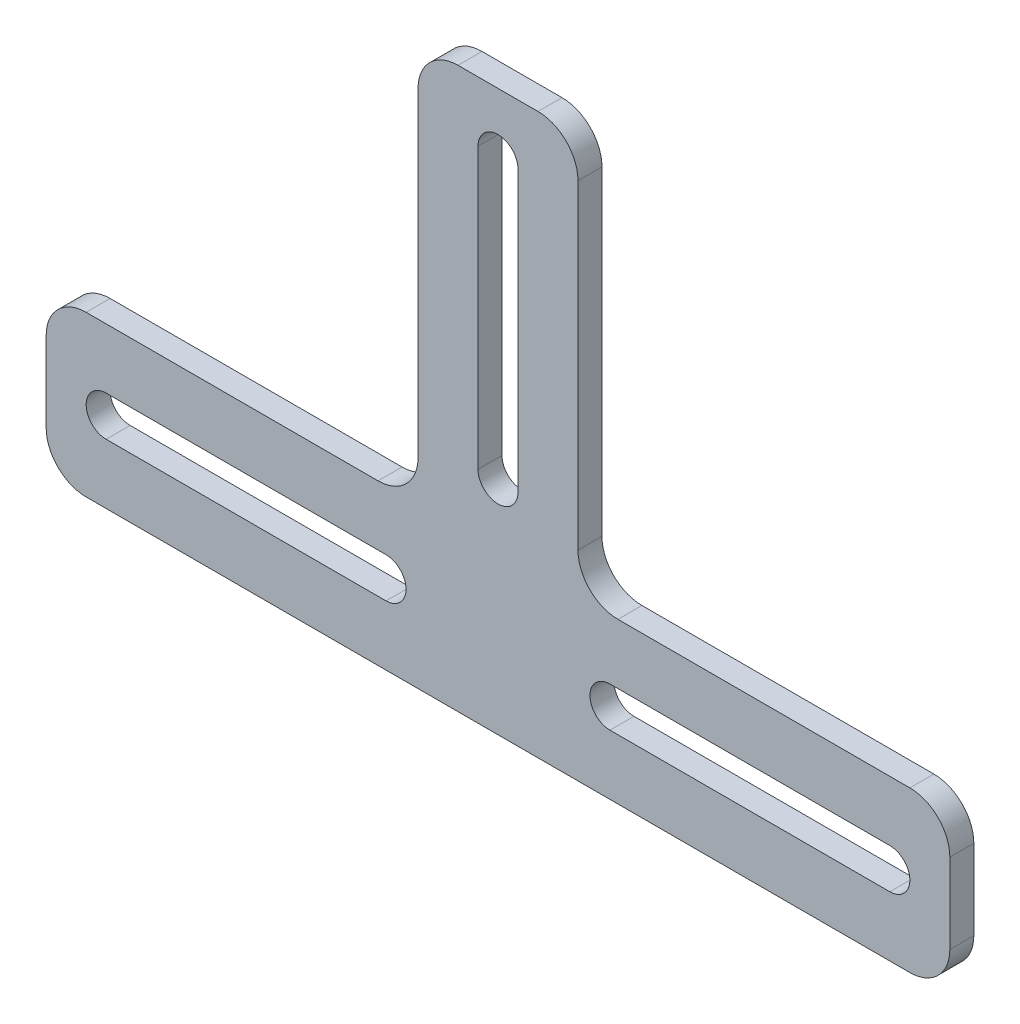
ISO-10303-21;
HEADER;
FILE_DESCRIPTION(('STEP AP214'),'2;1');
FILE_NAME('part.step','',(''),(''),'','','');
FILE_SCHEMA(('AUTOMOTIVE_DESIGN { 1 0 10303 214 1 1 1 1 }'));
ENDSEC;
DATA;
#1=APPLICATION_CONTEXT('core data for automotive mechanical design processes');
#2=APPLICATION_PROTOCOL_DEFINITION('international standard','automotive_design',2000,#1);
#3=PRODUCT_CONTEXT('',#1,'mechanical');
#4=PRODUCT('Part','Part','',(#3));
#5=PRODUCT_RELATED_PRODUCT_CATEGORY('part','',(#4));
#6=PRODUCT_DEFINITION_FORMATION('','',#4);
#7=PRODUCT_DEFINITION_CONTEXT('part definition',#1,'design');
#8=PRODUCT_DEFINITION('design','',#6,#7);
#9=PRODUCT_DEFINITION_SHAPE('','',#8);
#10=(LENGTH_UNIT() NAMED_UNIT(*) SI_UNIT(.MILLI.,.METRE.));
#11=(NAMED_UNIT(*) PLANE_ANGLE_UNIT() SI_UNIT($,.RADIAN.));
#12=(NAMED_UNIT(*) SI_UNIT($,.STERADIAN.) SOLID_ANGLE_UNIT());
#13=UNCERTAINTY_MEASURE_WITH_UNIT(LENGTH_MEASURE(1.E-05),#10,'distance_accuracy_value','');
#14=(GEOMETRIC_REPRESENTATION_CONTEXT(3) GLOBAL_UNCERTAINTY_ASSIGNED_CONTEXT((#13)) GLOBAL_UNIT_ASSIGNED_CONTEXT((#10,
#11,#12)) REPRESENTATION_CONTEXT('',''));
#15=CARTESIAN_POINT('',(0.,0.,0.));
#16=DIRECTION('',(0.,0.,1.));
#17=DIRECTION('',(1.,0.,0.));
#18=AXIS2_PLACEMENT_3D('',#15,#16,#17);
#19=CARTESIAN_POINT('',(0.,0.,3.));
#20=DIRECTION('',(0.,0.,-1.));
#21=DIRECTION('',(-1.,0.,0.));
#22=AXIS2_PLACEMENT_3D('',#19,#20,#21);
#23=PLANE('',#22);
#24=CARTESIAN_POINT('',(49.,9.99999999999996,3.));
#25=DIRECTION('',(0.,0.,1.));
#26=DIRECTION('',(1.,0.,0.));
#27=AXIS2_PLACEMENT_3D('',#24,#25,#26);
#28=CIRCLE('',#27,2.5);
#29=CARTESIAN_POINT('',(49.,7.49999999999997,3.));
#30=VERTEX_POINT('',#29);
#31=CARTESIAN_POINT('',(49.,12.5,3.));
#32=VERTEX_POINT('',#31);
#33=EDGE_CURVE('E261',#30,#32,#28,.T.);
#34=ORIENTED_EDGE('',*,*,#33,.F.);
#35=DIRECTION('',(1.,0.,0.));
#36=VECTOR('',#35,1.);
#37=CARTESIAN_POINT('',(49.,7.49999999999997,3.));
#38=LINE('',#37,#36);
#39=CARTESIAN_POINT('',(14.,7.49999999999997,3.));
#40=VERTEX_POINT('',#39);
#41=EDGE_CURVE('E269',#40,#30,#38,.T.);
#42=ORIENTED_EDGE('',*,*,#41,.F.);
#43=CARTESIAN_POINT('',(14.,9.99999999999997,3.));
#44=DIRECTION('',(0.,0.,1.));
#45=DIRECTION('',(1.,0.,0.));
#46=AXIS2_PLACEMENT_3D('',#43,#44,#45);
#47=CIRCLE('',#46,2.5);
#48=CARTESIAN_POINT('',(14.,12.5,3.));
#49=VERTEX_POINT('',#48);
#50=EDGE_CURVE('E266',#49,#40,#47,.T.);
#51=ORIENTED_EDGE('',*,*,#50,.F.);
#52=DIRECTION('',(-1.,0.,0.));
#53=VECTOR('',#52,1.);
#54=CARTESIAN_POINT('',(49.,12.5,3.));
#55=LINE('',#54,#53);
#56=EDGE_CURVE('E263',#32,#49,#55,.T.);
#57=ORIENTED_EDGE('',*,*,#56,.F.);
#58=EDGE_LOOP('',(#34,#42,#51,#57));
#59=FACE_BOUND('',#58,.T.);
#60=DIRECTION('',(0.,-1.,0.));
#61=VECTOR('',#60,1.);
#62=CARTESIAN_POINT('',(-56.5,0.,3.));
#63=LINE('',#62,#61);
#64=CARTESIAN_POINT('',(-56.5,15.,3.));
#65=VERTEX_POINT('',#64);
#66=CARTESIAN_POINT('',(-56.5,5.00000000000004,3.));
#67=VERTEX_POINT('',#66);
#68=EDGE_CURVE('E330',#65,#67,#63,.T.);
#69=ORIENTED_EDGE('',*,*,#68,.T.);
#70=CARTESIAN_POINT('',(-51.5,5.00000000000003,3.));
#71=DIRECTION('',(0.,0.,-1.));
#72=DIRECTION('',(-1.,0.,0.));
#73=AXIS2_PLACEMENT_3D('',#70,#71,#72);
#74=CIRCLE('',#73,5.);
#75=CARTESIAN_POINT('',(-51.5,0.,3.));
#76=VERTEX_POINT('',#75);
#77=EDGE_CURVE('E408',#67,#76,#74,.F.);
#78=ORIENTED_EDGE('',*,*,#77,.T.);
#79=DIRECTION('',(1.,0.,0.));
#80=VECTOR('',#79,1.);
#81=CARTESIAN_POINT('',(0.,0.,3.));
#82=LINE('',#81,#80);
#83=CARTESIAN_POINT('',(51.5,0.,3.));
#84=VERTEX_POINT('',#83);
#85=EDGE_CURVE('E333',#76,#84,#82,.T.);
#86=ORIENTED_EDGE('',*,*,#85,.T.);
#87=CARTESIAN_POINT('',(51.5,4.99999999999997,3.));
#88=DIRECTION('',(0.,0.,-1.));
#89=DIRECTION('',(-1.,0.,0.));
#90=AXIS2_PLACEMENT_3D('',#87,#88,#89);
#91=CIRCLE('',#90,5.);
#92=CARTESIAN_POINT('',(56.5,4.99999999999997,3.));
#93=VERTEX_POINT('',#92);
#94=EDGE_CURVE('E401',#84,#93,#91,.F.);
#95=ORIENTED_EDGE('',*,*,#94,.T.);
#96=DIRECTION('',(0.,1.,0.));
#97=VECTOR('',#96,1.);
#98=CARTESIAN_POINT('',(56.5,0.,3.));
#99=LINE('',#98,#97);
#100=CARTESIAN_POINT('',(56.5,15.,3.));
#101=VERTEX_POINT('',#100);
#102=EDGE_CURVE('E336',#93,#101,#99,.T.);
#103=ORIENTED_EDGE('',*,*,#102,.T.);
#104=CARTESIAN_POINT('',(51.5,15.,3.));
#105=DIRECTION('',(0.,0.,-1.));
#106=DIRECTION('',(-1.,0.,0.));
#107=AXIS2_PLACEMENT_3D('',#104,#105,#106);
#108=CIRCLE('',#107,5.);
#109=CARTESIAN_POINT('',(51.5,20.,3.));
#110=VERTEX_POINT('',#109);
#111=EDGE_CURVE('E399',#101,#110,#108,.F.);
#112=ORIENTED_EDGE('',*,*,#111,.T.);
#113=DIRECTION('',(-1.,0.,0.));
#114=VECTOR('',#113,1.);
#115=CARTESIAN_POINT('',(56.5,20.,3.));
#116=LINE('',#115,#114);
#117=CARTESIAN_POINT('',(15.,20.,3.));
#118=VERTEX_POINT('',#117);
#119=EDGE_CURVE('E339',#110,#118,#116,.T.);
#120=ORIENTED_EDGE('',*,*,#119,.T.);
#121=CARTESIAN_POINT('',(15.,25.,3.));
#122=DIRECTION('',(0.,0.,-1.));
#123=DIRECTION('',(-1.,0.,0.));
#124=AXIS2_PLACEMENT_3D('',#121,#122,#123);
#125=CIRCLE('',#124,5.);
#126=CARTESIAN_POINT('',(10.,25.,3.));
#127=VERTEX_POINT('',#126);
#128=EDGE_CURVE('E11',#118,#127,#125,.T.);
#129=ORIENTED_EDGE('',*,*,#128,.T.);
#130=DIRECTION('',(0.,1.,0.));
#131=VECTOR('',#130,1.);
#132=CARTESIAN_POINT('',(10.,20.,3.));
#133=LINE('',#132,#131);
#134=CARTESIAN_POINT('',(10.,65.,3.));
#135=VERTEX_POINT('',#134);
#136=EDGE_CURVE('E342',#127,#135,#133,.T.);
#137=ORIENTED_EDGE('',*,*,#136,.T.);
#138=CARTESIAN_POINT('',(5.,65.,3.));
#139=DIRECTION('',(0.,0.,-1.));
#140=DIRECTION('',(-1.,0.,0.));
#141=AXIS2_PLACEMENT_3D('',#138,#139,#140);
#142=CIRCLE('',#141,5.);
#143=CARTESIAN_POINT('',(5.,70.,3.));
#144=VERTEX_POINT('',#143);
#145=EDGE_CURVE('E55',#135,#144,#142,.F.);
#146=ORIENTED_EDGE('',*,*,#145,.T.);
#147=DIRECTION('',(-1.,0.,0.));
#148=VECTOR('',#147,1.);
#149=CARTESIAN_POINT('',(-10.,70.,3.));
#150=LINE('',#149,#148);
#151=CARTESIAN_POINT('',(-5.,70.,3.));
#152=VERTEX_POINT('',#151);
#153=EDGE_CURVE('E344',#144,#152,#150,.T.);
#154=ORIENTED_EDGE('',*,*,#153,.T.);
#155=CARTESIAN_POINT('',(-5.,65.,3.));
#156=DIRECTION('',(0.,0.,-1.));
#157=DIRECTION('',(-1.,0.,0.));
#158=AXIS2_PLACEMENT_3D('',#155,#156,#157);
#159=CIRCLE('',#158,5.);
#160=CARTESIAN_POINT('',(-10.,65.,3.));
#161=VERTEX_POINT('',#160);
#162=EDGE_CURVE('E406',#152,#161,#159,.F.);
#163=ORIENTED_EDGE('',*,*,#162,.T.);
#164=DIRECTION('',(0.,-1.,0.));
#165=VECTOR('',#164,1.);
#166=CARTESIAN_POINT('',(-10.,20.,3.));
#167=LINE('',#166,#165);
#168=CARTESIAN_POINT('',(-10.,25.,3.));
#169=VERTEX_POINT('',#168);
#170=EDGE_CURVE('E323',#161,#169,#167,.T.);
#171=ORIENTED_EDGE('',*,*,#170,.T.);
#172=CARTESIAN_POINT('',(-15.,25.,3.));
#173=DIRECTION('',(0.,0.,-1.));
#174=DIRECTION('',(-1.,0.,0.));
#175=AXIS2_PLACEMENT_3D('',#172,#173,#174);
#176=CIRCLE('',#175,5.);
#177=CARTESIAN_POINT('',(-15.,20.,3.));
#178=VERTEX_POINT('',#177);
#179=EDGE_CURVE('E431',#169,#178,#176,.T.);
#180=ORIENTED_EDGE('',*,*,#179,.T.);
#181=DIRECTION('',(-1.,0.,0.));
#182=VECTOR('',#181,1.);
#183=CARTESIAN_POINT('',(-56.5,20.,3.));
#184=LINE('',#183,#182);
#185=CARTESIAN_POINT('',(-51.5,20.,3.));
#186=VERTEX_POINT('',#185);
#187=EDGE_CURVE('E326',#178,#186,#184,.T.);
#188=ORIENTED_EDGE('',*,*,#187,.T.);
#189=CARTESIAN_POINT('',(-51.5,15.,3.));
#190=DIRECTION('',(0.,0.,-1.));
#191=DIRECTION('',(-1.,0.,0.));
#192=AXIS2_PLACEMENT_3D('',#189,#190,#191);
#193=CIRCLE('',#192,5.);
#194=EDGE_CURVE('E403',#186,#65,#193,.F.);
#195=ORIENTED_EDGE('',*,*,#194,.T.);
#196=EDGE_LOOP('',(#69,#78,#86,#95,#103,#112,#120,#129,#137,#146,#154,#163,#171,#180,#188,#195));
#197=FACE_BOUND('',#196,.T.);
#198=CARTESIAN_POINT('',(0.,62.5,3.));
#199=DIRECTION('',(0.,0.,1.));
#200=DIRECTION('',(1.,0.,0.));
#201=AXIS2_PLACEMENT_3D('',#198,#199,#200);
#202=CIRCLE('',#201,2.5);
#203=CARTESIAN_POINT('',(2.5,62.5,3.));
#204=VERTEX_POINT('',#203);
#205=CARTESIAN_POINT('',(-2.5,62.5,3.));
#206=VERTEX_POINT('',#205);
#207=EDGE_CURVE('E292',#204,#206,#202,.T.);
#208=ORIENTED_EDGE('',*,*,#207,.F.);
#209=DIRECTION('',(0.,1.,0.));
#210=VECTOR('',#209,1.);
#211=CARTESIAN_POINT('',(2.5,62.5,3.));
#212=LINE('',#211,#210);
#213=CARTESIAN_POINT('',(2.50000000000001,27.5,3.));
#214=VERTEX_POINT('',#213);
#215=EDGE_CURVE('E300',#214,#204,#212,.T.);
#216=ORIENTED_EDGE('',*,*,#215,.F.);
#217=CARTESIAN_POINT('',(0.,27.5,3.));
#218=DIRECTION('',(0.,0.,1.));
#219=DIRECTION('',(1.,0.,0.));
#220=AXIS2_PLACEMENT_3D('',#217,#218,#219);
#221=CIRCLE('',#220,2.5);
#222=CARTESIAN_POINT('',(-2.5,27.5,3.));
#223=VERTEX_POINT('',#222);
#224=EDGE_CURVE('E297',#223,#214,#221,.T.);
#225=ORIENTED_EDGE('',*,*,#224,.F.);
#226=DIRECTION('',(0.,-1.,0.));
#227=VECTOR('',#226,1.);
#228=CARTESIAN_POINT('',(-2.5,62.5,3.));
#229=LINE('',#228,#227);
#230=EDGE_CURVE('E294',#206,#223,#229,.T.);
#231=ORIENTED_EDGE('',*,*,#230,.F.);
#232=EDGE_LOOP('',(#208,#216,#225,#231));
#233=FACE_BOUND('',#232,.T.);
#234=CARTESIAN_POINT('',(-49.,9.99999999999996,3.));
#235=DIRECTION('',(0.,0.,1.));
#236=DIRECTION('',(-1.,0.,0.));
#237=AXIS2_PLACEMENT_3D('',#234,#235,#236);
#238=CIRCLE('',#237,2.5);
#239=CARTESIAN_POINT('',(-49.,12.5,3.));
#240=VERTEX_POINT('',#239);
#241=CARTESIAN_POINT('',(-49.,7.49999999999997,3.));
#242=VERTEX_POINT('',#241);
#243=EDGE_CURVE('E220',#240,#242,#238,.T.);
#244=ORIENTED_EDGE('',*,*,#243,.F.);
#245=DIRECTION('',(-1.,0.,0.));
#246=VECTOR('',#245,1.);
#247=CARTESIAN_POINT('',(-49.,12.5,3.));
#248=LINE('',#247,#246);
#249=CARTESIAN_POINT('',(-14.,12.5,3.));
#250=VERTEX_POINT('',#249);
#251=EDGE_CURVE('E245',#250,#240,#248,.T.);
#252=ORIENTED_EDGE('',*,*,#251,.F.);
#253=CARTESIAN_POINT('',(-14.,9.99999999999997,3.));
#254=DIRECTION('',(0.,0.,1.));
#255=DIRECTION('',(-1.,0.,0.));
#256=AXIS2_PLACEMENT_3D('',#253,#254,#255);
#257=CIRCLE('',#256,2.5);
#258=CARTESIAN_POINT('',(-14.,7.49999999999997,3.));
#259=VERTEX_POINT('',#258);
#260=EDGE_CURVE('E243',#259,#250,#257,.T.);
#261=ORIENTED_EDGE('',*,*,#260,.F.);
#262=DIRECTION('',(1.,0.,0.));
#263=VECTOR('',#262,1.);
#264=CARTESIAN_POINT('',(-49.,7.49999999999997,3.));
#265=LINE('',#264,#263);
#266=EDGE_CURVE('E230',#242,#259,#265,.T.);
#267=ORIENTED_EDGE('',*,*,#266,.F.);
#268=EDGE_LOOP('',(#244,#252,#261,#267));
#269=FACE_BOUND('',#268,.T.);
#270=ADVANCED_FACE('F33',(#59,#197,#233,#269),#23,.F.);
#271=CARTESIAN_POINT('',(0.,0.,0.));
#272=DIRECTION('',(0.,0.,-1.));
#273=DIRECTION('',(-1.,0.,0.));
#274=AXIS2_PLACEMENT_3D('',#271,#272,#273);
#275=PLANE('',#274);
#276=DIRECTION('',(1.,0.,0.));
#277=VECTOR('',#276,1.);
#278=CARTESIAN_POINT('',(0.,0.,0.));
#279=LINE('',#278,#277);
#280=CARTESIAN_POINT('',(-51.5,0.,0.));
#281=VERTEX_POINT('',#280);
#282=CARTESIAN_POINT('',(51.5,0.,0.));
#283=VERTEX_POINT('',#282);
#284=EDGE_CURVE('E355',#281,#283,#279,.T.);
#285=ORIENTED_EDGE('',*,*,#284,.F.);
#286=CARTESIAN_POINT('',(-51.5,5.00000000000003,0.));
#287=DIRECTION('',(0.,0.,-1.));
#288=DIRECTION('',(-1.,0.,0.));
#289=AXIS2_PLACEMENT_3D('',#286,#287,#288);
#290=CIRCLE('',#289,5.);
#291=CARTESIAN_POINT('',(-56.5,5.00000000000004,0.));
#292=VERTEX_POINT('',#291);
#293=EDGE_CURVE('E392',#281,#292,#290,.T.);
#294=ORIENTED_EDGE('',*,*,#293,.T.);
#295=DIRECTION('',(0.,-1.,0.));
#296=VECTOR('',#295,1.);
#297=CARTESIAN_POINT('',(-56.5,0.,0.));
#298=LINE('',#297,#296);
#299=CARTESIAN_POINT('',(-56.5,15.,0.));
#300=VERTEX_POINT('',#299);
#301=EDGE_CURVE('E352',#300,#292,#298,.T.);
#302=ORIENTED_EDGE('',*,*,#301,.F.);
#303=CARTESIAN_POINT('',(-51.5,15.,0.));
#304=DIRECTION('',(0.,0.,-1.));
#305=DIRECTION('',(-1.,0.,0.));
#306=AXIS2_PLACEMENT_3D('',#303,#304,#305);
#307=CIRCLE('',#306,5.);
#308=CARTESIAN_POINT('',(-51.5,20.,0.));
#309=VERTEX_POINT('',#308);
#310=EDGE_CURVE('E386',#300,#309,#307,.T.);
#311=ORIENTED_EDGE('',*,*,#310,.T.);
#312=DIRECTION('',(-1.,0.,0.));
#313=VECTOR('',#312,1.);
#314=CARTESIAN_POINT('',(-56.5,20.,0.));
#315=LINE('',#314,#313);
#316=CARTESIAN_POINT('',(-15.,20.,0.));
#317=VERTEX_POINT('',#316);
#318=EDGE_CURVE('E349',#317,#309,#315,.T.);
#319=ORIENTED_EDGE('',*,*,#318,.F.);
#320=CARTESIAN_POINT('',(-15.,25.,0.));
#321=DIRECTION('',(0.,0.,-1.));
#322=DIRECTION('',(-1.,0.,0.));
#323=AXIS2_PLACEMENT_3D('',#320,#321,#322);
#324=CIRCLE('',#323,5.);
#325=CARTESIAN_POINT('',(-10.,25.,0.));
#326=VERTEX_POINT('',#325);
#327=EDGE_CURVE('E429',#317,#326,#324,.F.);
#328=ORIENTED_EDGE('',*,*,#327,.T.);
#329=DIRECTION('',(0.,-1.,0.));
#330=VECTOR('',#329,1.);
#331=CARTESIAN_POINT('',(-10.,20.,0.));
#332=LINE('',#331,#330);
#333=CARTESIAN_POINT('',(-10.,65.,0.));
#334=VERTEX_POINT('',#333);
#335=EDGE_CURVE('E322',#334,#326,#332,.T.);
#336=ORIENTED_EDGE('',*,*,#335,.F.);
#337=CARTESIAN_POINT('',(-5.,65.,0.));
#338=DIRECTION('',(0.,0.,-1.));
#339=DIRECTION('',(-1.,0.,0.));
#340=AXIS2_PLACEMENT_3D('',#337,#338,#339);
#341=CIRCLE('',#340,5.);
#342=CARTESIAN_POINT('',(-5.,70.,0.));
#343=VERTEX_POINT('',#342);
#344=EDGE_CURVE('E390',#334,#343,#341,.T.);
#345=ORIENTED_EDGE('',*,*,#344,.T.);
#346=DIRECTION('',(-1.,0.,0.));
#347=VECTOR('',#346,1.);
#348=CARTESIAN_POINT('',(-10.,70.,0.));
#349=LINE('',#348,#347);
#350=CARTESIAN_POINT('',(5.,70.,0.));
#351=VERTEX_POINT('',#350);
#352=EDGE_CURVE('E327',#351,#343,#349,.T.);
#353=ORIENTED_EDGE('',*,*,#352,.F.);
#354=CARTESIAN_POINT('',(5.,65.,0.));
#355=DIRECTION('',(0.,0.,-1.));
#356=DIRECTION('',(-1.,0.,0.));
#357=AXIS2_PLACEMENT_3D('',#354,#355,#356);
#358=CIRCLE('',#357,5.);
#359=CARTESIAN_POINT('',(10.,65.,0.));
#360=VERTEX_POINT('',#359);
#361=EDGE_CURVE('E388',#351,#360,#358,.T.);
#362=ORIENTED_EDGE('',*,*,#361,.T.);
#363=DIRECTION('',(0.,1.,0.));
#364=VECTOR('',#363,1.);
#365=CARTESIAN_POINT('',(10.,20.,0.));
#366=LINE('',#365,#364);
#367=CARTESIAN_POINT('',(10.,25.,0.));
#368=VERTEX_POINT('',#367);
#369=EDGE_CURVE('E364',#368,#360,#366,.T.);
#370=ORIENTED_EDGE('',*,*,#369,.F.);
#371=CARTESIAN_POINT('',(15.,25.,0.));
#372=DIRECTION('',(0.,0.,-1.));
#373=DIRECTION('',(-1.,0.,0.));
#374=AXIS2_PLACEMENT_3D('',#371,#372,#373);
#375=CIRCLE('',#374,5.);
#376=CARTESIAN_POINT('',(15.,20.,0.));
#377=VERTEX_POINT('',#376);
#378=EDGE_CURVE('E41',#368,#377,#375,.F.);
#379=ORIENTED_EDGE('',*,*,#378,.T.);
#380=DIRECTION('',(-1.,0.,0.));
#381=VECTOR('',#380,1.);
#382=CARTESIAN_POINT('',(56.5,20.,0.));
#383=LINE('',#382,#381);
#384=CARTESIAN_POINT('',(51.5,20.,0.));
#385=VERTEX_POINT('',#384);
#386=EDGE_CURVE('E361',#385,#377,#383,.T.);
#387=ORIENTED_EDGE('',*,*,#386,.F.);
#388=CARTESIAN_POINT('',(51.5,15.,0.));
#389=DIRECTION('',(0.,0.,-1.));
#390=DIRECTION('',(-1.,0.,0.));
#391=AXIS2_PLACEMENT_3D('',#388,#389,#390);
#392=CIRCLE('',#391,5.);
#393=CARTESIAN_POINT('',(56.5,15.,0.));
#394=VERTEX_POINT('',#393);
#395=EDGE_CURVE('E382',#385,#394,#392,.T.);
#396=ORIENTED_EDGE('',*,*,#395,.T.);
#397=DIRECTION('',(0.,1.,0.));
#398=VECTOR('',#397,1.);
#399=CARTESIAN_POINT('',(56.5,0.,0.));
#400=LINE('',#399,#398);
#401=CARTESIAN_POINT('',(56.5,4.99999999999997,0.));
#402=VERTEX_POINT('',#401);
#403=EDGE_CURVE('E358',#402,#394,#400,.T.);
#404=ORIENTED_EDGE('',*,*,#403,.F.);
#405=CARTESIAN_POINT('',(51.5,4.99999999999997,0.));
#406=DIRECTION('',(0.,0.,-1.));
#407=DIRECTION('',(-1.,0.,0.));
#408=AXIS2_PLACEMENT_3D('',#405,#406,#407);
#409=CIRCLE('',#408,5.);
#410=EDGE_CURVE('E384',#402,#283,#409,.T.);
#411=ORIENTED_EDGE('',*,*,#410,.T.);
#412=EDGE_LOOP('',(#285,#294,#302,#311,#319,#328,#336,#345,#353,#362,#370,#379,#387,#396,#404,#411));
#413=FACE_BOUND('',#412,.T.);
#414=DIRECTION('',(0.,1.,0.));
#415=VECTOR('',#414,1.);
#416=CARTESIAN_POINT('',(2.5,62.5,0.));
#417=LINE('',#416,#415);
#418=CARTESIAN_POINT('',(2.50000000000001,27.5,0.));
#419=VERTEX_POINT('',#418);
#420=CARTESIAN_POINT('',(2.5,62.5,0.));
#421=VERTEX_POINT('',#420);
#422=EDGE_CURVE('E295',#419,#421,#417,.T.);
#423=ORIENTED_EDGE('',*,*,#422,.T.);
#424=CARTESIAN_POINT('',(0.,62.5,0.));
#425=DIRECTION('',(0.,0.,1.));
#426=DIRECTION('',(1.,0.,0.));
#427=AXIS2_PLACEMENT_3D('',#424,#425,#426);
#428=CIRCLE('',#427,2.5);
#429=CARTESIAN_POINT('',(-2.5,62.5,0.));
#430=VERTEX_POINT('',#429);
#431=EDGE_CURVE('E291',#421,#430,#428,.T.);
#432=ORIENTED_EDGE('',*,*,#431,.T.);
#433=DIRECTION('',(0.,-1.,0.));
#434=VECTOR('',#433,1.);
#435=CARTESIAN_POINT('',(-2.5,62.5,0.));
#436=LINE('',#435,#434);
#437=CARTESIAN_POINT('',(-2.5,27.5,0.));
#438=VERTEX_POINT('',#437);
#439=EDGE_CURVE('E305',#430,#438,#436,.T.);
#440=ORIENTED_EDGE('',*,*,#439,.T.);
#441=CARTESIAN_POINT('',(0.,27.5,0.));
#442=DIRECTION('',(0.,0.,1.));
#443=DIRECTION('',(1.,0.,0.));
#444=AXIS2_PLACEMENT_3D('',#441,#442,#443);
#445=CIRCLE('',#444,2.5);
#446=EDGE_CURVE('E308',#438,#419,#445,.T.);
#447=ORIENTED_EDGE('',*,*,#446,.T.);
#448=EDGE_LOOP('',(#423,#432,#440,#447));
#449=FACE_BOUND('',#448,.T.);
#450=DIRECTION('',(1.,0.,0.));
#451=VECTOR('',#450,1.);
#452=CARTESIAN_POINT('',(49.,7.49999999999997,0.));
#453=LINE('',#452,#451);
#454=CARTESIAN_POINT('',(14.,7.49999999999997,0.));
#455=VERTEX_POINT('',#454);
#456=CARTESIAN_POINT('',(49.,7.49999999999997,0.));
#457=VERTEX_POINT('',#456);
#458=EDGE_CURVE('E264',#455,#457,#453,.T.);
#459=ORIENTED_EDGE('',*,*,#458,.T.);
#460=CARTESIAN_POINT('',(49.,9.99999999999996,0.));
#461=DIRECTION('',(0.,0.,1.));
#462=DIRECTION('',(1.,0.,0.));
#463=AXIS2_PLACEMENT_3D('',#460,#461,#462);
#464=CIRCLE('',#463,2.5);
#465=CARTESIAN_POINT('',(49.,12.5,0.));
#466=VERTEX_POINT('',#465);
#467=EDGE_CURVE('E238',#457,#466,#464,.T.);
#468=ORIENTED_EDGE('',*,*,#467,.T.);
#469=DIRECTION('',(-1.,0.,0.));
#470=VECTOR('',#469,1.);
#471=CARTESIAN_POINT('',(49.,12.5,0.));
#472=LINE('',#471,#470);
#473=CARTESIAN_POINT('',(14.,12.5,0.));
#474=VERTEX_POINT('',#473);
#475=EDGE_CURVE('E274',#466,#474,#472,.T.);
#476=ORIENTED_EDGE('',*,*,#475,.T.);
#477=CARTESIAN_POINT('',(14.,9.99999999999997,0.));
#478=DIRECTION('',(0.,0.,1.));
#479=DIRECTION('',(1.,0.,0.));
#480=AXIS2_PLACEMENT_3D('',#477,#478,#479);
#481=CIRCLE('',#480,2.5);
#482=EDGE_CURVE('E277',#474,#455,#481,.T.);
#483=ORIENTED_EDGE('',*,*,#482,.T.);
#484=EDGE_LOOP('',(#459,#468,#476,#483));
#485=FACE_BOUND('',#484,.T.);
#486=DIRECTION('',(-1.,0.,0.));
#487=VECTOR('',#486,1.);
#488=CARTESIAN_POINT('',(-49.,12.5,0.));
#489=LINE('',#488,#487);
#490=CARTESIAN_POINT('',(-14.,12.5,0.));
#491=VERTEX_POINT('',#490);
#492=CARTESIAN_POINT('',(-49.,12.5,0.));
#493=VERTEX_POINT('',#492);
#494=EDGE_CURVE('E231',#491,#493,#489,.T.);
#495=ORIENTED_EDGE('',*,*,#494,.T.);
#496=CARTESIAN_POINT('',(-49.,9.99999999999996,0.));
#497=DIRECTION('',(0.,0.,1.));
#498=DIRECTION('',(-1.,0.,0.));
#499=AXIS2_PLACEMENT_3D('',#496,#497,#498);
#500=CIRCLE('',#499,2.5);
#501=CARTESIAN_POINT('',(-49.,7.49999999999997,0.));
#502=VERTEX_POINT('',#501);
#503=EDGE_CURVE('E249',#493,#502,#500,.T.);
#504=ORIENTED_EDGE('',*,*,#503,.T.);
#505=DIRECTION('',(1.,0.,0.));
#506=VECTOR('',#505,1.);
#507=CARTESIAN_POINT('',(-49.,7.49999999999997,0.));
#508=LINE('',#507,#506);
#509=CARTESIAN_POINT('',(-14.,7.49999999999997,0.));
#510=VERTEX_POINT('',#509);
#511=EDGE_CURVE('E237',#502,#510,#508,.T.);
#512=ORIENTED_EDGE('',*,*,#511,.T.);
#513=CARTESIAN_POINT('',(-14.,9.99999999999997,0.));
#514=DIRECTION('',(0.,0.,1.));
#515=DIRECTION('',(-1.,0.,0.));
#516=AXIS2_PLACEMENT_3D('',#513,#514,#515);
#517=CIRCLE('',#516,2.5);
#518=EDGE_CURVE('E252',#510,#491,#517,.T.);
#519=ORIENTED_EDGE('',*,*,#518,.T.);
#520=EDGE_LOOP('',(#495,#504,#512,#519));
#521=FACE_BOUND('',#520,.T.);
#522=ADVANCED_FACE('F436',(#413,#449,#485,#521),#275,.T.);
#523=CARTESIAN_POINT('',(-10.,20.,3.));
#524=DIRECTION('',(1.,0.,0.));
#525=DIRECTION('',(0.,0.,-1.));
#526=AXIS2_PLACEMENT_3D('',#523,#524,#525);
#527=PLANE('',#526);
#528=ORIENTED_EDGE('',*,*,#335,.T.);
#529=DIRECTION('',(0.,0.,-1.));
#530=VECTOR('',#529,1.);
#531=CARTESIAN_POINT('',(-10.,25.,3.));
#532=LINE('',#531,#530);
#533=EDGE_CURVE('E375',#326,#169,#532,.F.);
#534=ORIENTED_EDGE('',*,*,#533,.T.);
#535=ORIENTED_EDGE('',*,*,#170,.F.);
#536=DIRECTION('',(0.,0.,-1.));
#537=VECTOR('',#536,1.);
#538=CARTESIAN_POINT('',(-10.,65.,3.));
#539=LINE('',#538,#537);
#540=EDGE_CURVE('E372',#161,#334,#539,.T.);
#541=ORIENTED_EDGE('',*,*,#540,.T.);
#542=EDGE_LOOP('',(#528,#534,#535,#541));
#543=FACE_BOUND('',#542,.T.);
#544=ADVANCED_FACE('F464',(#543),#527,.F.);
#545=CARTESIAN_POINT('',(-56.5,20.,3.));
#546=DIRECTION('',(0.,-1.,0.));
#547=DIRECTION('',(1.,0.,0.));
#548=AXIS2_PLACEMENT_3D('',#545,#546,#547);
#549=PLANE('',#548);
#550=ORIENTED_EDGE('',*,*,#187,.F.);
#551=DIRECTION('',(0.,0.,-1.));
#552=VECTOR('',#551,1.);
#553=CARTESIAN_POINT('',(-15.,20.,0.));
#554=LINE('',#553,#552);
#555=EDGE_CURVE('E369',#178,#317,#554,.T.);
#556=ORIENTED_EDGE('',*,*,#555,.T.);
#557=ORIENTED_EDGE('',*,*,#318,.T.);
#558=DIRECTION('',(0.,0.,-1.));
#559=VECTOR('',#558,1.);
#560=CARTESIAN_POINT('',(-51.5,20.,3.));
#561=LINE('',#560,#559);
#562=EDGE_CURVE('E346',#309,#186,#561,.F.);
#563=ORIENTED_EDGE('',*,*,#562,.T.);
#564=EDGE_LOOP('',(#550,#556,#557,#563));
#565=FACE_BOUND('',#564,.T.);
#566=ADVANCED_FACE('F473',(#565),#549,.F.);
#567=CARTESIAN_POINT('',(-56.5,0.,3.));
#568=DIRECTION('',(1.,0.,0.));
#569=DIRECTION('',(0.,1.,0.));
#570=AXIS2_PLACEMENT_3D('',#567,#568,#569);
#571=PLANE('',#570);
#572=ORIENTED_EDGE('',*,*,#301,.T.);
#573=DIRECTION('',(0.,0.,-1.));
#574=VECTOR('',#573,1.);
#575=CARTESIAN_POINT('',(-56.5,5.00000000000004,3.));
#576=LINE('',#575,#574);
#577=EDGE_CURVE('E397',#292,#67,#576,.F.);
#578=ORIENTED_EDGE('',*,*,#577,.T.);
#579=ORIENTED_EDGE('',*,*,#68,.F.);
#580=DIRECTION('',(0.,0.,-1.));
#581=VECTOR('',#580,1.);
#582=CARTESIAN_POINT('',(-56.5,15.,3.));
#583=LINE('',#582,#581);
#584=EDGE_CURVE('E394',#65,#300,#583,.T.);
#585=ORIENTED_EDGE('',*,*,#584,.T.);
#586=EDGE_LOOP('',(#572,#578,#579,#585));
#587=FACE_BOUND('',#586,.T.);
#588=ADVANCED_FACE('F482',(#587),#571,.F.);
#589=CARTESIAN_POINT('',(0.,0.,3.));
#590=DIRECTION('',(0.,1.,0.));
#591=DIRECTION('',(-1.,0.,0.));
#592=AXIS2_PLACEMENT_3D('',#589,#590,#591);
#593=PLANE('',#592);
#594=ORIENTED_EDGE('',*,*,#85,.F.);
#595=DIRECTION('',(0.,0.,-1.));
#596=VECTOR('',#595,1.);
#597=CARTESIAN_POINT('',(-51.5,0.,3.));
#598=LINE('',#597,#596);
#599=EDGE_CURVE('E379',#76,#281,#598,.T.);
#600=ORIENTED_EDGE('',*,*,#599,.T.);
#601=ORIENTED_EDGE('',*,*,#284,.T.);
#602=DIRECTION('',(0.,0.,-1.));
#603=VECTOR('',#602,1.);
#604=CARTESIAN_POINT('',(51.5,0.,3.));
#605=LINE('',#604,#603);
#606=EDGE_CURVE('E377',#283,#84,#605,.F.);
#607=ORIENTED_EDGE('',*,*,#606,.T.);
#608=EDGE_LOOP('',(#594,#600,#601,#607));
#609=FACE_BOUND('',#608,.T.);
#610=ADVANCED_FACE('F490',(#609),#593,.F.);
#611=CARTESIAN_POINT('',(56.5,0.,3.));
#612=DIRECTION('',(-1.,0.,0.));
#613=DIRECTION('',(0.,0.,1.));
#614=AXIS2_PLACEMENT_3D('',#611,#612,#613);
#615=PLANE('',#614);
#616=ORIENTED_EDGE('',*,*,#102,.F.);
#617=DIRECTION('',(0.,0.,-1.));
#618=VECTOR('',#617,1.);
#619=CARTESIAN_POINT('',(56.5,4.99999999999997,3.));
#620=LINE('',#619,#618);
#621=EDGE_CURVE('E426',#93,#402,#620,.T.);
#622=ORIENTED_EDGE('',*,*,#621,.T.);
#623=ORIENTED_EDGE('',*,*,#403,.T.);
#624=DIRECTION('',(0.,0.,-1.));
#625=VECTOR('',#624,1.);
#626=CARTESIAN_POINT('',(56.5,15.,3.));
#627=LINE('',#626,#625);
#628=EDGE_CURVE('E424',#394,#101,#627,.F.);
#629=ORIENTED_EDGE('',*,*,#628,.T.);
#630=EDGE_LOOP('',(#616,#622,#623,#629));
#631=FACE_BOUND('',#630,.T.);
#632=ADVANCED_FACE('F499',(#631),#615,.F.);
#633=CARTESIAN_POINT('',(56.5,20.,3.));
#634=DIRECTION('',(0.,-1.,0.));
#635=DIRECTION('',(1.,0.,0.));
#636=AXIS2_PLACEMENT_3D('',#633,#634,#635);
#637=PLANE('',#636);
#638=ORIENTED_EDGE('',*,*,#386,.T.);
#639=DIRECTION('',(0.,0.,-1.));
#640=VECTOR('',#639,1.);
#641=CARTESIAN_POINT('',(15.,20.,3.));
#642=LINE('',#641,#640);
#643=EDGE_CURVE('E422',#377,#118,#642,.F.);
#644=ORIENTED_EDGE('',*,*,#643,.T.);
#645=ORIENTED_EDGE('',*,*,#119,.F.);
#646=DIRECTION('',(0.,0.,-1.));
#647=VECTOR('',#646,1.);
#648=CARTESIAN_POINT('',(51.5,20.,3.));
#649=LINE('',#648,#647);
#650=EDGE_CURVE('E419',#110,#385,#649,.T.);
#651=ORIENTED_EDGE('',*,*,#650,.T.);
#652=EDGE_LOOP('',(#638,#644,#645,#651));
#653=FACE_BOUND('',#652,.T.);
#654=ADVANCED_FACE('F442',(#653),#637,.F.);
#655=CARTESIAN_POINT('',(10.,20.,3.));
#656=DIRECTION('',(-1.,0.,0.));
#657=DIRECTION('',(0.,0.,1.));
#658=AXIS2_PLACEMENT_3D('',#655,#656,#657);
#659=PLANE('',#658);
#660=ORIENTED_EDGE('',*,*,#369,.T.);
#661=DIRECTION('',(0.,0.,-1.));
#662=VECTOR('',#661,1.);
#663=CARTESIAN_POINT('',(10.,65.,3.));
#664=LINE('',#663,#662);
#665=EDGE_CURVE('E417',#360,#135,#664,.F.);
#666=ORIENTED_EDGE('',*,*,#665,.T.);
#667=ORIENTED_EDGE('',*,*,#136,.F.);
#668=DIRECTION('',(0.,0.,-1.));
#669=VECTOR('',#668,1.);
#670=CARTESIAN_POINT('',(10.,25.,0.));
#671=LINE('',#670,#669);
#672=EDGE_CURVE('E414',#127,#368,#671,.T.);
#673=ORIENTED_EDGE('',*,*,#672,.T.);
#674=EDGE_LOOP('',(#660,#666,#667,#673));
#675=FACE_BOUND('',#674,.T.);
#676=ADVANCED_FACE('F450',(#675),#659,.F.);
#677=CARTESIAN_POINT('',(-10.,70.,3.));
#678=DIRECTION('',(0.,-1.,0.));
#679=DIRECTION('',(0.,0.,-1.));
#680=AXIS2_PLACEMENT_3D('',#677,#678,#679);
#681=PLANE('',#680);
#682=ORIENTED_EDGE('',*,*,#352,.T.);
#683=DIRECTION('',(0.,0.,-1.));
#684=VECTOR('',#683,1.);
#685=CARTESIAN_POINT('',(-5.,70.,3.));
#686=LINE('',#685,#684);
#687=EDGE_CURVE('E48',#343,#152,#686,.F.);
#688=ORIENTED_EDGE('',*,*,#687,.T.);
#689=ORIENTED_EDGE('',*,*,#153,.F.);
#690=DIRECTION('',(0.,0.,-1.));
#691=VECTOR('',#690,1.);
#692=CARTESIAN_POINT('',(5.,70.,3.));
#693=LINE('',#692,#691);
#694=EDGE_CURVE('E410',#144,#351,#693,.T.);
#695=ORIENTED_EDGE('',*,*,#694,.T.);
#696=EDGE_LOOP('',(#682,#688,#689,#695));
#697=FACE_BOUND('',#696,.T.);
#698=ADVANCED_FACE('F456',(#697),#681,.F.);
#699=CARTESIAN_POINT('',(0.,62.5,3.));
#700=DIRECTION('',(0.,0.,-1.));
#701=DIRECTION('',(-1.,0.,0.));
#702=AXIS2_PLACEMENT_3D('',#699,#700,#701);
#703=CYLINDRICAL_SURFACE('',#702,2.5);
#704=ORIENTED_EDGE('',*,*,#431,.F.);
#705=DIRECTION('',(0.,0.,-1.));
#706=VECTOR('',#705,1.);
#707=CARTESIAN_POINT('',(2.5,62.5,3.));
#708=LINE('',#707,#706);
#709=EDGE_CURVE('E302',#204,#421,#708,.T.);
#710=ORIENTED_EDGE('',*,*,#709,.F.);
#711=ORIENTED_EDGE('',*,*,#207,.T.);
#712=DIRECTION('',(0.,0.,-1.));
#713=VECTOR('',#712,1.);
#714=CARTESIAN_POINT('',(-2.5,62.5,3.));
#715=LINE('',#714,#713);
#716=EDGE_CURVE('E319',#206,#430,#715,.T.);
#717=ORIENTED_EDGE('',*,*,#716,.T.);
#718=EDGE_LOOP('',(#704,#710,#711,#717));
#719=FACE_BOUND('',#718,.T.);
#720=ADVANCED_FACE('F516',(#719),#703,.F.);
#721=CARTESIAN_POINT('',(-2.5,62.5,3.));
#722=DIRECTION('',(1.,0.,0.));
#723=DIRECTION('',(0.,1.,0.));
#724=AXIS2_PLACEMENT_3D('',#721,#722,#723);
#725=PLANE('',#724);
#726=ORIENTED_EDGE('',*,*,#439,.F.);
#727=ORIENTED_EDGE('',*,*,#716,.F.);
#728=ORIENTED_EDGE('',*,*,#230,.T.);
#729=DIRECTION('',(0.,0.,-1.));
#730=VECTOR('',#729,1.);
#731=CARTESIAN_POINT('',(-2.5,27.5,3.));
#732=LINE('',#731,#730);
#733=EDGE_CURVE('E317',#223,#438,#732,.T.);
#734=ORIENTED_EDGE('',*,*,#733,.T.);
#735=EDGE_LOOP('',(#726,#727,#728,#734));
#736=FACE_BOUND('',#735,.T.);
#737=ADVANCED_FACE('F673',(#736),#725,.T.);
#738=CARTESIAN_POINT('',(0.,27.5,3.));
#739=DIRECTION('',(0.,0.,-1.));
#740=DIRECTION('',(-1.,0.,0.));
#741=AXIS2_PLACEMENT_3D('',#738,#739,#740);
#742=CYLINDRICAL_SURFACE('',#741,2.5);
#743=ORIENTED_EDGE('',*,*,#446,.F.);
#744=ORIENTED_EDGE('',*,*,#733,.F.);
#745=ORIENTED_EDGE('',*,*,#224,.T.);
#746=DIRECTION('',(0.,0.,-1.));
#747=VECTOR('',#746,1.);
#748=CARTESIAN_POINT('',(2.50000000000001,27.5,3.));
#749=LINE('',#748,#747);
#750=EDGE_CURVE('E315',#214,#419,#749,.T.);
#751=ORIENTED_EDGE('',*,*,#750,.T.);
#752=EDGE_LOOP('',(#743,#744,#745,#751));
#753=FACE_BOUND('',#752,.T.);
#754=ADVANCED_FACE('F664',(#753),#742,.F.);
#755=CARTESIAN_POINT('',(2.5,62.5,3.));
#756=DIRECTION('',(-1.,0.,0.));
#757=DIRECTION('',(0.,-1.,0.));
#758=AXIS2_PLACEMENT_3D('',#755,#756,#757);
#759=PLANE('',#758);
#760=ORIENTED_EDGE('',*,*,#422,.F.);
#761=ORIENTED_EDGE('',*,*,#750,.F.);
#762=ORIENTED_EDGE('',*,*,#215,.T.);
#763=ORIENTED_EDGE('',*,*,#709,.T.);
#764=EDGE_LOOP('',(#760,#761,#762,#763));
#765=FACE_BOUND('',#764,.T.);
#766=ADVANCED_FACE('F655',(#765),#759,.T.);
#767=CARTESIAN_POINT('',(49.,9.99999999999996,3.));
#768=DIRECTION('',(0.,0.,-1.));
#769=DIRECTION('',(-1.,0.,0.));
#770=AXIS2_PLACEMENT_3D('',#767,#768,#769);
#771=CYLINDRICAL_SURFACE('',#770,2.5);
#772=ORIENTED_EDGE('',*,*,#467,.F.);
#773=DIRECTION('',(0.,0.,-1.));
#774=VECTOR('',#773,1.);
#775=CARTESIAN_POINT('',(49.,7.49999999999997,3.));
#776=LINE('',#775,#774);
#777=EDGE_CURVE('E271',#30,#457,#776,.T.);
#778=ORIENTED_EDGE('',*,*,#777,.F.);
#779=ORIENTED_EDGE('',*,*,#33,.T.);
#780=DIRECTION('',(0.,0.,-1.));
#781=VECTOR('',#780,1.);
#782=CARTESIAN_POINT('',(49.,12.5,3.));
#783=LINE('',#782,#781);
#784=EDGE_CURVE('E288',#32,#466,#783,.T.);
#785=ORIENTED_EDGE('',*,*,#784,.T.);
#786=EDGE_LOOP('',(#772,#778,#779,#785));
#787=FACE_BOUND('',#786,.T.);
#788=ADVANCED_FACE('F646',(#787),#771,.F.);
#789=CARTESIAN_POINT('',(49.,12.5,3.));
#790=DIRECTION('',(0.,-1.,0.));
#791=DIRECTION('',(1.,0.,0.));
#792=AXIS2_PLACEMENT_3D('',#789,#790,#791);
#793=PLANE('',#792);
#794=ORIENTED_EDGE('',*,*,#475,.F.);
#795=ORIENTED_EDGE('',*,*,#784,.F.);
#796=ORIENTED_EDGE('',*,*,#56,.T.);
#797=DIRECTION('',(0.,0.,-1.));
#798=VECTOR('',#797,1.);
#799=CARTESIAN_POINT('',(14.,12.5,3.));
#800=LINE('',#799,#798);
#801=EDGE_CURVE('E286',#49,#474,#800,.T.);
#802=ORIENTED_EDGE('',*,*,#801,.T.);
#803=EDGE_LOOP('',(#794,#795,#796,#802));
#804=FACE_BOUND('',#803,.T.);
#805=ADVANCED_FACE('F637',(#804),#793,.T.);
#806=CARTESIAN_POINT('',(14.,9.99999999999997,3.));
#807=DIRECTION('',(0.,0.,-1.));
#808=DIRECTION('',(-1.,0.,0.));
#809=AXIS2_PLACEMENT_3D('',#806,#807,#808);
#810=CYLINDRICAL_SURFACE('',#809,2.5);
#811=ORIENTED_EDGE('',*,*,#482,.F.);
#812=ORIENTED_EDGE('',*,*,#801,.F.);
#813=ORIENTED_EDGE('',*,*,#50,.T.);
#814=DIRECTION('',(0.,0.,-1.));
#815=VECTOR('',#814,1.);
#816=CARTESIAN_POINT('',(14.,7.49999999999997,3.));
#817=LINE('',#816,#815);
#818=EDGE_CURVE('E284',#40,#455,#817,.T.);
#819=ORIENTED_EDGE('',*,*,#818,.T.);
#820=EDGE_LOOP('',(#811,#812,#813,#819));
#821=FACE_BOUND('',#820,.T.);
#822=ADVANCED_FACE('F628',(#821),#810,.F.);
#823=CARTESIAN_POINT('',(49.,7.49999999999997,3.));
#824=DIRECTION('',(0.,1.,0.));
#825=DIRECTION('',(-1.,0.,0.));
#826=AXIS2_PLACEMENT_3D('',#823,#824,#825);
#827=PLANE('',#826);
#828=ORIENTED_EDGE('',*,*,#458,.F.);
#829=ORIENTED_EDGE('',*,*,#818,.F.);
#830=ORIENTED_EDGE('',*,*,#41,.T.);
#831=ORIENTED_EDGE('',*,*,#777,.T.);
#832=EDGE_LOOP('',(#828,#829,#830,#831));
#833=FACE_BOUND('',#832,.T.);
#834=ADVANCED_FACE('F620',(#833),#827,.T.);
#835=CARTESIAN_POINT('',(-49.,9.99999999999996,3.));
#836=DIRECTION('',(0.,0.,-1.));
#837=DIRECTION('',(-1.,0.,0.));
#838=AXIS2_PLACEMENT_3D('',#835,#836,#837);
#839=CYLINDRICAL_SURFACE('',#838,2.5);
#840=ORIENTED_EDGE('',*,*,#503,.F.);
#841=DIRECTION('',(0.,0.,-1.));
#842=VECTOR('',#841,1.);
#843=CARTESIAN_POINT('',(-49.,12.5,3.));
#844=LINE('',#843,#842);
#845=EDGE_CURVE('E226',#240,#493,#844,.T.);
#846=ORIENTED_EDGE('',*,*,#845,.F.);
#847=ORIENTED_EDGE('',*,*,#243,.T.);
#848=DIRECTION('',(0.,0.,-1.));
#849=VECTOR('',#848,1.);
#850=CARTESIAN_POINT('',(-49.,7.49999999999997,3.));
#851=LINE('',#850,#849);
#852=EDGE_CURVE('E223',#242,#502,#851,.T.);
#853=ORIENTED_EDGE('',*,*,#852,.T.);
#854=EDGE_LOOP('',(#840,#846,#847,#853));
#855=FACE_BOUND('',#854,.T.);
#856=ADVANCED_FACE('F222',(#855),#839,.F.);
#857=CARTESIAN_POINT('',(-49.,7.49999999999997,3.));
#858=DIRECTION('',(0.,1.,0.));
#859=DIRECTION('',(-1.,0.,0.));
#860=AXIS2_PLACEMENT_3D('',#857,#858,#859);
#861=PLANE('',#860);
#862=ORIENTED_EDGE('',*,*,#511,.F.);
#863=ORIENTED_EDGE('',*,*,#852,.F.);
#864=ORIENTED_EDGE('',*,*,#266,.T.);
#865=DIRECTION('',(0.,0.,-1.));
#866=VECTOR('',#865,1.);
#867=CARTESIAN_POINT('',(-14.,7.49999999999997,3.));
#868=LINE('',#867,#866);
#869=EDGE_CURVE('E239',#259,#510,#868,.T.);
#870=ORIENTED_EDGE('',*,*,#869,.T.);
#871=EDGE_LOOP('',(#862,#863,#864,#870));
#872=FACE_BOUND('',#871,.T.);
#873=ADVANCED_FACE('F234',(#872),#861,.T.);
#874=CARTESIAN_POINT('',(-14.,9.99999999999997,3.));
#875=DIRECTION('',(0.,0.,-1.));
#876=DIRECTION('',(-1.,0.,0.));
#877=AXIS2_PLACEMENT_3D('',#874,#875,#876);
#878=CYLINDRICAL_SURFACE('',#877,2.5);
#879=ORIENTED_EDGE('',*,*,#518,.F.);
#880=ORIENTED_EDGE('',*,*,#869,.F.);
#881=ORIENTED_EDGE('',*,*,#260,.T.);
#882=DIRECTION('',(0.,0.,-1.));
#883=VECTOR('',#882,1.);
#884=CARTESIAN_POINT('',(-14.,12.5,3.));
#885=LINE('',#884,#883);
#886=EDGE_CURVE('E258',#250,#491,#885,.T.);
#887=ORIENTED_EDGE('',*,*,#886,.T.);
#888=EDGE_LOOP('',(#879,#880,#881,#887));
#889=FACE_BOUND('',#888,.T.);
#890=ADVANCED_FACE('F596',(#889),#878,.F.);
#891=CARTESIAN_POINT('',(-49.,12.5,3.));
#892=DIRECTION('',(0.,-1.,0.));
#893=DIRECTION('',(1.,0.,0.));
#894=AXIS2_PLACEMENT_3D('',#891,#892,#893);
#895=PLANE('',#894);
#896=ORIENTED_EDGE('',*,*,#494,.F.);
#897=ORIENTED_EDGE('',*,*,#886,.F.);
#898=ORIENTED_EDGE('',*,*,#251,.T.);
#899=ORIENTED_EDGE('',*,*,#845,.T.);
#900=EDGE_LOOP('',(#896,#897,#898,#899));
#901=FACE_BOUND('',#900,.T.);
#902=ADVANCED_FACE('F537',(#901),#895,.T.);
#903=CARTESIAN_POINT('',(-15.,25.,3.));
#904=DIRECTION('',(0.,0.,1.));
#905=DIRECTION('',(1.,0.,0.));
#906=AXIS2_PLACEMENT_3D('',#903,#904,#905);
#907=CYLINDRICAL_SURFACE('',#906,5.);
#908=ORIENTED_EDGE('',*,*,#179,.F.);
#909=ORIENTED_EDGE('',*,*,#533,.F.);
#910=ORIENTED_EDGE('',*,*,#327,.F.);
#911=ORIENTED_EDGE('',*,*,#555,.F.);
#912=EDGE_LOOP('',(#908,#909,#910,#911));
#913=FACE_BOUND('',#912,.T.);
#914=ADVANCED_FACE('F470',(#913),#907,.F.);
#915=CARTESIAN_POINT('',(-51.5,5.00000000000003,3.));
#916=DIRECTION('',(0.,0.,-1.));
#917=DIRECTION('',(-1.,0.,0.));
#918=AXIS2_PLACEMENT_3D('',#915,#916,#917);
#919=CYLINDRICAL_SURFACE('',#918,5.);
#920=ORIENTED_EDGE('',*,*,#77,.F.);
#921=ORIENTED_EDGE('',*,*,#577,.F.);
#922=ORIENTED_EDGE('',*,*,#293,.F.);
#923=ORIENTED_EDGE('',*,*,#599,.F.);
#924=EDGE_LOOP('',(#920,#921,#922,#923));
#925=FACE_BOUND('',#924,.T.);
#926=ADVANCED_FACE('F488',(#925),#919,.T.);
#927=CARTESIAN_POINT('',(-5.,65.,3.));
#928=DIRECTION('',(0.,0.,-1.));
#929=DIRECTION('',(-1.,0.,0.));
#930=AXIS2_PLACEMENT_3D('',#927,#928,#929);
#931=CYLINDRICAL_SURFACE('',#930,5.);
#932=ORIENTED_EDGE('',*,*,#162,.F.);
#933=ORIENTED_EDGE('',*,*,#687,.F.);
#934=ORIENTED_EDGE('',*,*,#344,.F.);
#935=ORIENTED_EDGE('',*,*,#540,.F.);
#936=EDGE_LOOP('',(#932,#933,#934,#935));
#937=FACE_BOUND('',#936,.T.);
#938=ADVANCED_FACE('F461',(#937),#931,.T.);
#939=CARTESIAN_POINT('',(5.,65.,3.));
#940=DIRECTION('',(0.,0.,-1.));
#941=DIRECTION('',(-1.,0.,0.));
#942=AXIS2_PLACEMENT_3D('',#939,#940,#941);
#943=CYLINDRICAL_SURFACE('',#942,5.);
#944=ORIENTED_EDGE('',*,*,#145,.F.);
#945=ORIENTED_EDGE('',*,*,#665,.F.);
#946=ORIENTED_EDGE('',*,*,#361,.F.);
#947=ORIENTED_EDGE('',*,*,#694,.F.);
#948=EDGE_LOOP('',(#944,#945,#946,#947));
#949=FACE_BOUND('',#948,.T.);
#950=ADVANCED_FACE('F453',(#949),#943,.T.);
#951=CARTESIAN_POINT('',(-51.5,15.,3.));
#952=DIRECTION('',(0.,0.,-1.));
#953=DIRECTION('',(-1.,0.,0.));
#954=AXIS2_PLACEMENT_3D('',#951,#952,#953);
#955=CYLINDRICAL_SURFACE('',#954,5.);
#956=ORIENTED_EDGE('',*,*,#194,.F.);
#957=ORIENTED_EDGE('',*,*,#562,.F.);
#958=ORIENTED_EDGE('',*,*,#310,.F.);
#959=ORIENTED_EDGE('',*,*,#584,.F.);
#960=EDGE_LOOP('',(#956,#957,#958,#959));
#961=FACE_BOUND('',#960,.T.);
#962=ADVANCED_FACE('F479',(#961),#955,.T.);
#963=CARTESIAN_POINT('',(15.,25.,3.));
#964=DIRECTION('',(0.,0.,1.));
#965=DIRECTION('',(1.,0.,0.));
#966=AXIS2_PLACEMENT_3D('',#963,#964,#965);
#967=CYLINDRICAL_SURFACE('',#966,5.);
#968=ORIENTED_EDGE('',*,*,#128,.F.);
#969=ORIENTED_EDGE('',*,*,#643,.F.);
#970=ORIENTED_EDGE('',*,*,#378,.F.);
#971=ORIENTED_EDGE('',*,*,#672,.F.);
#972=EDGE_LOOP('',(#968,#969,#970,#971));
#973=FACE_BOUND('',#972,.T.);
#974=ADVANCED_FACE('F446',(#973),#967,.F.);
#975=CARTESIAN_POINT('',(51.5,4.99999999999997,3.));
#976=DIRECTION('',(0.,0.,-1.));
#977=DIRECTION('',(-1.,0.,0.));
#978=AXIS2_PLACEMENT_3D('',#975,#976,#977);
#979=CYLINDRICAL_SURFACE('',#978,5.);
#980=ORIENTED_EDGE('',*,*,#94,.F.);
#981=ORIENTED_EDGE('',*,*,#606,.F.);
#982=ORIENTED_EDGE('',*,*,#410,.F.);
#983=ORIENTED_EDGE('',*,*,#621,.F.);
#984=EDGE_LOOP('',(#980,#981,#982,#983));
#985=FACE_BOUND('',#984,.T.);
#986=ADVANCED_FACE('F496',(#985),#979,.T.);
#987=CARTESIAN_POINT('',(51.5,15.,3.));
#988=DIRECTION('',(0.,0.,-1.));
#989=DIRECTION('',(-1.,0.,0.));
#990=AXIS2_PLACEMENT_3D('',#987,#988,#989);
#991=CYLINDRICAL_SURFACE('',#990,5.);
#992=ORIENTED_EDGE('',*,*,#111,.F.);
#993=ORIENTED_EDGE('',*,*,#628,.F.);
#994=ORIENTED_EDGE('',*,*,#395,.F.);
#995=ORIENTED_EDGE('',*,*,#650,.F.);
#996=EDGE_LOOP('',(#992,#993,#994,#995));
#997=FACE_BOUND('',#996,.T.);
#998=ADVANCED_FACE('F35',(#997),#991,.T.);
#999=CLOSED_SHELL('',(#270,#522,#544,#566,#588,#610,#632,#654,#676,#698,#720,#737,#754,#766,
#788,#805,#822,#834,#856,#873,#890,#902,#914,#926,#938,#950,#962,#974,#986,#998));
#1000=MANIFOLD_SOLID_BREP('B2',#999);
#1001=ADVANCED_BREP_SHAPE_REPRESENTATION('',(#18,#1000),#14);
#1002=SHAPE_DEFINITION_REPRESENTATION(#9,#1001);
ENDSEC;
END-ISO-10303-21;
